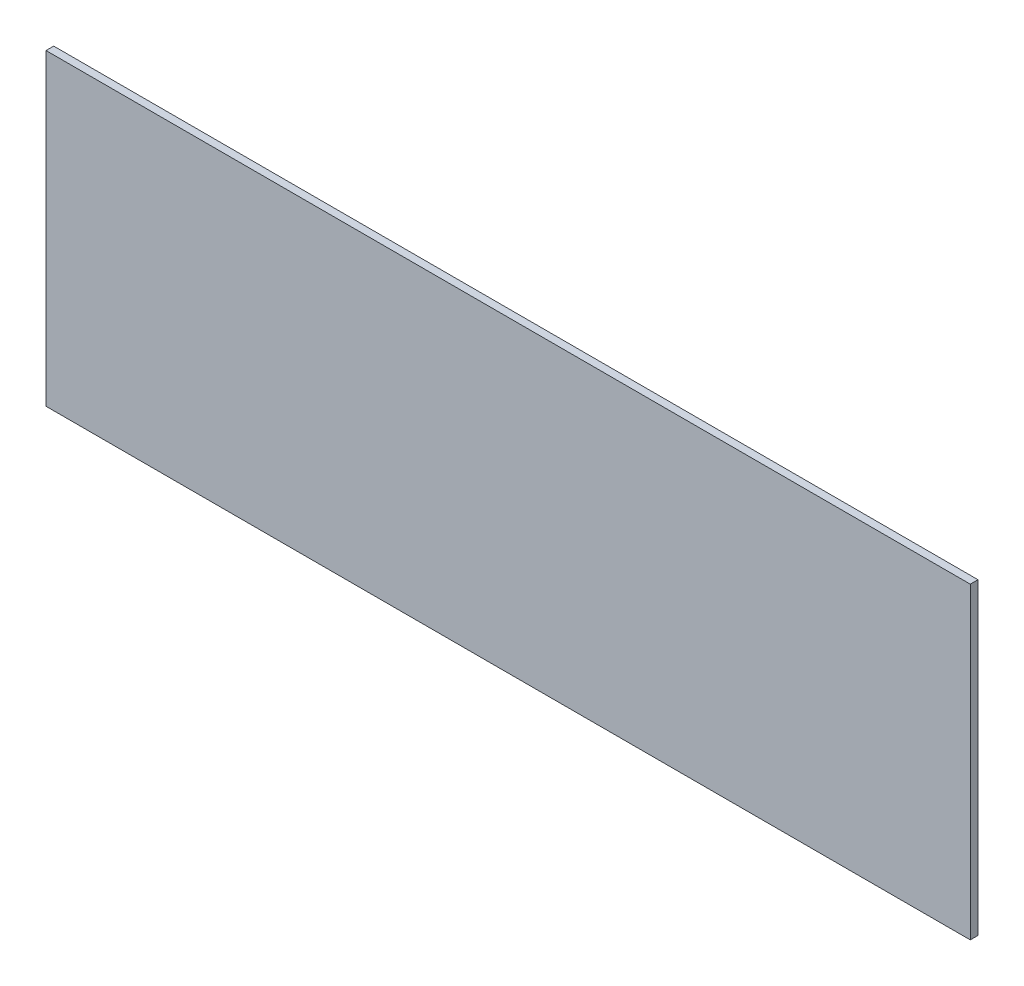
ISO-10303-21;
HEADER;
FILE_DESCRIPTION(('STEP AP214'),'2;1');
FILE_NAME('part.step','',(''),(''),'','','');
FILE_SCHEMA(('AUTOMOTIVE_DESIGN { 1 0 10303 214 1 1 1 1 }'));
ENDSEC;
DATA;
#1=APPLICATION_CONTEXT('core data for automotive mechanical design processes');
#2=APPLICATION_PROTOCOL_DEFINITION('international standard','automotive_design',2000,#1);
#3=PRODUCT_CONTEXT('',#1,'mechanical');
#4=PRODUCT('Part','Part','',(#3));
#5=PRODUCT_RELATED_PRODUCT_CATEGORY('part','',(#4));
#6=PRODUCT_DEFINITION_FORMATION('','',#4);
#7=PRODUCT_DEFINITION_CONTEXT('part definition',#1,'design');
#8=PRODUCT_DEFINITION('design','',#6,#7);
#9=PRODUCT_DEFINITION_SHAPE('','',#8);
#10=(LENGTH_UNIT() NAMED_UNIT(*) SI_UNIT(.MILLI.,.METRE.));
#11=(NAMED_UNIT(*) PLANE_ANGLE_UNIT() SI_UNIT($,.RADIAN.));
#12=(NAMED_UNIT(*) SI_UNIT($,.STERADIAN.) SOLID_ANGLE_UNIT());
#13=UNCERTAINTY_MEASURE_WITH_UNIT(LENGTH_MEASURE(1.E-05),#10,'distance_accuracy_value','');
#14=(GEOMETRIC_REPRESENTATION_CONTEXT(3) GLOBAL_UNCERTAINTY_ASSIGNED_CONTEXT((#13)) GLOBAL_UNIT_ASSIGNED_CONTEXT((#10,
#11,#12)) REPRESENTATION_CONTEXT('',''));
#15=CARTESIAN_POINT('',(0.,0.,0.));
#16=DIRECTION('',(0.,0.,1.));
#17=DIRECTION('',(1.,0.,0.));
#18=AXIS2_PLACEMENT_3D('',#15,#16,#17);
#19=CARTESIAN_POINT('',(6000.,2000.,100.));
#20=DIRECTION('',(-1.,0.,0.));
#21=DIRECTION('',(0.,0.,1.));
#22=AXIS2_PLACEMENT_3D('',#19,#20,#21);
#23=PLANE('',#22);
#24=DIRECTION('',(0.,1.,0.));
#25=VECTOR('',#24,1.);
#26=CARTESIAN_POINT('',(6000.,2000.,0.));
#27=LINE('',#26,#25);
#28=CARTESIAN_POINT('',(6000.,-2000.,0.));
#29=VERTEX_POINT('',#28);
#30=CARTESIAN_POINT('',(6000.,2000.,0.));
#31=VERTEX_POINT('',#30);
#32=EDGE_CURVE('E113',#29,#31,#27,.T.);
#33=ORIENTED_EDGE('',*,*,#32,.T.);
#34=DIRECTION('',(0.,0.,-1.));
#35=VECTOR('',#34,1.);
#36=CARTESIAN_POINT('',(6000.,2000.,100.));
#37=LINE('',#36,#35);
#38=CARTESIAN_POINT('',(6000.,2000.,100.));
#39=VERTEX_POINT('',#38);
#40=EDGE_CURVE('E11',#39,#31,#37,.T.);
#41=ORIENTED_EDGE('',*,*,#40,.F.);
#42=DIRECTION('',(0.,1.,0.));
#43=VECTOR('',#42,1.);
#44=CARTESIAN_POINT('',(6000.,2000.,100.));
#45=LINE('',#44,#43);
#46=CARTESIAN_POINT('',(6000.,-2000.,100.));
#47=VERTEX_POINT('',#46);
#48=EDGE_CURVE('E97',#47,#39,#45,.T.);
#49=ORIENTED_EDGE('',*,*,#48,.F.);
#50=DIRECTION('',(0.,0.,-1.));
#51=VECTOR('',#50,1.);
#52=CARTESIAN_POINT('',(6000.,-2000.,100.));
#53=LINE('',#52,#51);
#54=EDGE_CURVE('E109',#47,#29,#53,.T.);
#55=ORIENTED_EDGE('',*,*,#54,.T.);
#56=EDGE_LOOP('',(#33,#41,#49,#55));
#57=FACE_BOUND('',#56,.T.);
#58=ADVANCED_FACE('F45',(#57),#23,.F.);
#59=CARTESIAN_POINT('',(-6000.,2000.,100.));
#60=DIRECTION('',(0.,-1.,0.));
#61=DIRECTION('',(0.,0.,-1.));
#62=AXIS2_PLACEMENT_3D('',#59,#60,#61);
#63=PLANE('',#62);
#64=DIRECTION('',(-1.,0.,0.));
#65=VECTOR('',#64,1.);
#66=CARTESIAN_POINT('',(-6000.,2000.,0.));
#67=LINE('',#66,#65);
#68=CARTESIAN_POINT('',(-6000.,2000.,0.));
#69=VERTEX_POINT('',#68);
#70=EDGE_CURVE('E102',#31,#69,#67,.T.);
#71=ORIENTED_EDGE('',*,*,#70,.T.);
#72=DIRECTION('',(0.,0.,-1.));
#73=VECTOR('',#72,1.);
#74=CARTESIAN_POINT('',(-6000.,2000.,100.));
#75=LINE('',#74,#73);
#76=CARTESIAN_POINT('',(-6000.,2000.,100.));
#77=VERTEX_POINT('',#76);
#78=EDGE_CURVE('E54',#77,#69,#75,.T.);
#79=ORIENTED_EDGE('',*,*,#78,.F.);
#80=DIRECTION('',(-1.,0.,0.));
#81=VECTOR('',#80,1.);
#82=CARTESIAN_POINT('',(-6000.,2000.,100.));
#83=LINE('',#82,#81);
#84=EDGE_CURVE('E92',#39,#77,#83,.T.);
#85=ORIENTED_EDGE('',*,*,#84,.F.);
#86=ORIENTED_EDGE('',*,*,#40,.T.);
#87=EDGE_LOOP('',(#71,#79,#85,#86));
#88=FACE_BOUND('',#87,.T.);
#89=ADVANCED_FACE('F101',(#88),#63,.F.);
#90=CARTESIAN_POINT('',(-6000.,2000.,100.));
#91=DIRECTION('',(1.,0.,0.));
#92=DIRECTION('',(0.,0.,-1.));
#93=AXIS2_PLACEMENT_3D('',#90,#91,#92);
#94=PLANE('',#93);
#95=DIRECTION('',(0.,-1.,0.));
#96=VECTOR('',#95,1.);
#97=CARTESIAN_POINT('',(-6000.,2000.,0.));
#98=LINE('',#97,#96);
#99=CARTESIAN_POINT('',(-6000.,-2000.,0.));
#100=VERTEX_POINT('',#99);
#101=EDGE_CURVE('E79',#69,#100,#98,.T.);
#102=ORIENTED_EDGE('',*,*,#101,.T.);
#103=DIRECTION('',(0.,0.,-1.));
#104=VECTOR('',#103,1.);
#105=CARTESIAN_POINT('',(-6000.,-2000.,100.));
#106=LINE('',#105,#104);
#107=CARTESIAN_POINT('',(-6000.,-2000.,100.));
#108=VERTEX_POINT('',#107);
#109=EDGE_CURVE('E104',#108,#100,#106,.T.);
#110=ORIENTED_EDGE('',*,*,#109,.F.);
#111=DIRECTION('',(0.,-1.,0.));
#112=VECTOR('',#111,1.);
#113=CARTESIAN_POINT('',(-6000.,2000.,100.));
#114=LINE('',#113,#112);
#115=EDGE_CURVE('E95',#77,#108,#114,.T.);
#116=ORIENTED_EDGE('',*,*,#115,.F.);
#117=ORIENTED_EDGE('',*,*,#78,.T.);
#118=EDGE_LOOP('',(#102,#110,#116,#117));
#119=FACE_BOUND('',#118,.T.);
#120=ADVANCED_FACE('F105',(#119),#94,.F.);
#121=CARTESIAN_POINT('',(-6000.,-2000.,100.));
#122=DIRECTION('',(0.,1.,0.));
#123=DIRECTION('',(0.,0.,1.));
#124=AXIS2_PLACEMENT_3D('',#121,#122,#123);
#125=PLANE('',#124);
#126=DIRECTION('',(1.,0.,0.));
#127=VECTOR('',#126,1.);
#128=CARTESIAN_POINT('',(-6000.,-2000.,0.));
#129=LINE('',#128,#127);
#130=EDGE_CURVE('E85',#100,#29,#129,.T.);
#131=ORIENTED_EDGE('',*,*,#130,.T.);
#132=ORIENTED_EDGE('',*,*,#54,.F.);
#133=DIRECTION('',(1.,0.,0.));
#134=VECTOR('',#133,1.);
#135=CARTESIAN_POINT('',(-6000.,-2000.,100.));
#136=LINE('',#135,#134);
#137=EDGE_CURVE('E62',#108,#47,#136,.T.);
#138=ORIENTED_EDGE('',*,*,#137,.F.);
#139=ORIENTED_EDGE('',*,*,#109,.T.);
#140=EDGE_LOOP('',(#131,#132,#138,#139));
#141=FACE_BOUND('',#140,.T.);
#142=ADVANCED_FACE('F126',(#141),#125,.F.);
#143=CARTESIAN_POINT('',(0.,0.,100.));
#144=DIRECTION('',(0.,0.,1.));
#145=DIRECTION('',(1.,0.,0.));
#146=AXIS2_PLACEMENT_3D('',#143,#144,#145);
#147=PLANE('',#146);
#148=ORIENTED_EDGE('',*,*,#48,.T.);
#149=ORIENTED_EDGE('',*,*,#84,.T.);
#150=ORIENTED_EDGE('',*,*,#115,.T.);
#151=ORIENTED_EDGE('',*,*,#137,.T.);
#152=EDGE_LOOP('',(#148,#149,#150,#151));
#153=FACE_BOUND('',#152,.T.);
#154=ADVANCED_FACE('F93',(#153),#147,.T.);
#155=CARTESIAN_POINT('',(0.,0.,0.));
#156=DIRECTION('',(0.,0.,1.));
#157=DIRECTION('',(1.,0.,0.));
#158=AXIS2_PLACEMENT_3D('',#155,#156,#157);
#159=PLANE('',#158);
#160=ORIENTED_EDGE('',*,*,#32,.F.);
#161=ORIENTED_EDGE('',*,*,#130,.F.);
#162=ORIENTED_EDGE('',*,*,#101,.F.);
#163=ORIENTED_EDGE('',*,*,#70,.F.);
#164=EDGE_LOOP('',(#160,#161,#162,#163));
#165=FACE_BOUND('',#164,.T.);
#166=ADVANCED_FACE('F129',(#165),#159,.F.);
#167=CLOSED_SHELL('',(#58,#89,#120,#142,#154,#166));
#168=MANIFOLD_SOLID_BREP('B2',#167);
#169=ADVANCED_BREP_SHAPE_REPRESENTATION('',(#18,#168),#14);
#170=SHAPE_DEFINITION_REPRESENTATION(#9,#169);
ENDSEC;
END-ISO-10303-21;
